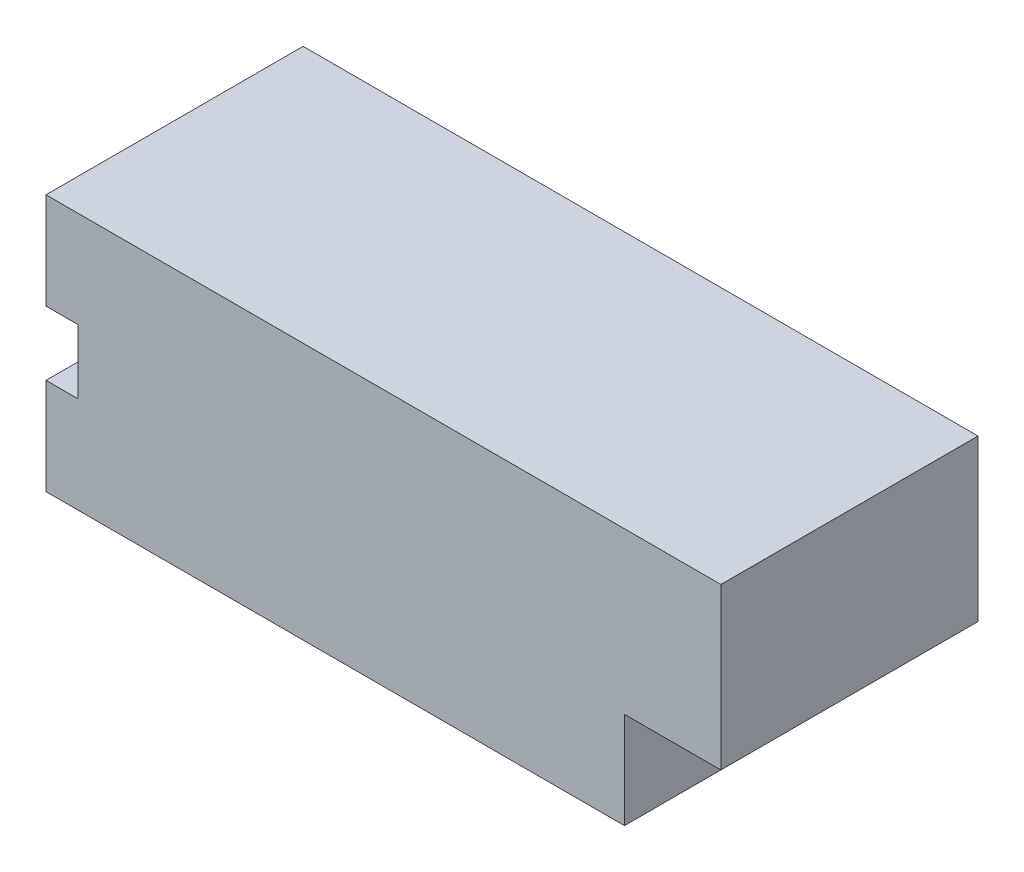
ISO-10303-21;
HEADER;
FILE_DESCRIPTION(('STEP AP214'),'2;1');
FILE_NAME('part.step','',(''),(''),'','','');
FILE_SCHEMA(('AUTOMOTIVE_DESIGN { 1 0 10303 214 1 1 1 1 }'));
ENDSEC;
DATA;
#1=APPLICATION_CONTEXT('core data for automotive mechanical design processes');
#2=APPLICATION_PROTOCOL_DEFINITION('international standard','automotive_design',2000,#1);
#3=PRODUCT_CONTEXT('',#1,'mechanical');
#4=PRODUCT('Part','Part','',(#3));
#5=PRODUCT_RELATED_PRODUCT_CATEGORY('part','',(#4));
#6=PRODUCT_DEFINITION_FORMATION('','',#4);
#7=PRODUCT_DEFINITION_CONTEXT('part definition',#1,'design');
#8=PRODUCT_DEFINITION('design','',#6,#7);
#9=PRODUCT_DEFINITION_SHAPE('','',#8);
#10=(LENGTH_UNIT() NAMED_UNIT(*) SI_UNIT(.MILLI.,.METRE.));
#11=(NAMED_UNIT(*) PLANE_ANGLE_UNIT() SI_UNIT($,.RADIAN.));
#12=(NAMED_UNIT(*) SI_UNIT($,.STERADIAN.) SOLID_ANGLE_UNIT());
#13=UNCERTAINTY_MEASURE_WITH_UNIT(LENGTH_MEASURE(1.E-05),#10,'distance_accuracy_value','');
#14=(GEOMETRIC_REPRESENTATION_CONTEXT(3) GLOBAL_UNCERTAINTY_ASSIGNED_CONTEXT((#13)) GLOBAL_UNIT_ASSIGNED_CONTEXT((#10,
#11,#12)) REPRESENTATION_CONTEXT('',''));
#15=CARTESIAN_POINT('',(0.,0.,0.));
#16=DIRECTION('',(0.,0.,1.));
#17=DIRECTION('',(1.,0.,0.));
#18=AXIS2_PLACEMENT_3D('',#15,#16,#17);
#19=CARTESIAN_POINT('',(80.,15.,20.));
#20=DIRECTION('',(0.,-1.,0.));
#21=DIRECTION('',(0.,0.,-1.));
#22=AXIS2_PLACEMENT_3D('',#19,#20,#21);
#23=PLANE('',#22);
#24=DIRECTION('',(-1.,0.,0.));
#25=VECTOR('',#24,1.);
#26=CARTESIAN_POINT('',(45.,15.,10.));
#27=LINE('',#26,#25);
#28=CARTESIAN_POINT('',(20.,15.,10.));
#29=VERTEX_POINT('',#28);
#30=CARTESIAN_POINT('',(15.,15.,10.));
#31=VERTEX_POINT('',#30);
#32=EDGE_CURVE('E209',#29,#31,#27,.T.);
#33=ORIENTED_EDGE('',*,*,#32,.T.);
#34=DIRECTION('',(0.,0.,-1.));
#35=VECTOR('',#34,1.);
#36=CARTESIAN_POINT('',(15.,15.,15.));
#37=LINE('',#36,#35);
#38=CARTESIAN_POINT('',(15.,15.,40.));
#39=VERTEX_POINT('',#38);
#40=EDGE_CURVE('E269',#39,#31,#37,.T.);
#41=ORIENTED_EDGE('',*,*,#40,.F.);
#42=DIRECTION('',(-1.,0.,0.));
#43=VECTOR('',#42,1.);
#44=CARTESIAN_POINT('',(70.,15.,40.));
#45=LINE('',#44,#43);
#46=CARTESIAN_POINT('',(20.,15.,40.));
#47=VERTEX_POINT('',#46);
#48=EDGE_CURVE('E11',#47,#39,#45,.T.);
#49=ORIENTED_EDGE('',*,*,#48,.F.);
#50=DIRECTION('',(0.,0.,-1.));
#51=VECTOR('',#50,1.);
#52=CARTESIAN_POINT('',(20.,15.,30.));
#53=LINE('',#52,#51);
#54=EDGE_CURVE('E236',#47,#29,#53,.T.);
#55=ORIENTED_EDGE('',*,*,#54,.T.);
#56=EDGE_LOOP('',(#33,#41,#49,#55));
#57=FACE_BOUND('',#56,.T.);
#58=ADVANCED_FACE('F40',(#57),#23,.F.);
#59=CARTESIAN_POINT('',(60.,20.,40.));
#60=DIRECTION('',(0.,0.,1.));
#61=DIRECTION('',(1.,0.,0.));
#62=AXIS2_PLACEMENT_3D('',#59,#60,#61);
#63=PLANE('',#62);
#64=ORIENTED_EDGE('',*,*,#48,.T.);
#65=DIRECTION('',(0.,1.,0.));
#66=VECTOR('',#65,1.);
#67=CARTESIAN_POINT('',(15.,20.,40.));
#68=LINE('',#67,#66);
#69=CARTESIAN_POINT('',(15.,0.,40.));
#70=VERTEX_POINT('',#69);
#71=EDGE_CURVE('E44',#70,#39,#68,.T.);
#72=ORIENTED_EDGE('',*,*,#71,.F.);
#73=DIRECTION('',(1.,0.,0.));
#74=VECTOR('',#73,1.);
#75=CARTESIAN_POINT('',(0.,0.,40.));
#76=LINE('',#75,#74);
#77=CARTESIAN_POINT('',(105.,0.,40.));
#78=VERTEX_POINT('',#77);
#79=EDGE_CURVE('E125',#70,#78,#76,.T.);
#80=ORIENTED_EDGE('',*,*,#79,.T.);
#81=DIRECTION('',(0.,1.,0.));
#82=VECTOR('',#81,1.);
#83=CARTESIAN_POINT('',(105.,10.,40.));
#84=LINE('',#83,#82);
#85=CARTESIAN_POINT('',(105.,15.,40.));
#86=VERTEX_POINT('',#85);
#87=EDGE_CURVE('E237',#78,#86,#84,.T.);
#88=ORIENTED_EDGE('',*,*,#87,.T.);
#89=DIRECTION('',(-1.,0.,0.));
#90=VECTOR('',#89,1.);
#91=CARTESIAN_POINT('',(70.,15.,40.));
#92=LINE('',#91,#90);
#93=CARTESIAN_POINT('',(120.,15.,40.));
#94=VERTEX_POINT('',#93);
#95=EDGE_CURVE('E196',#94,#86,#92,.T.);
#96=ORIENTED_EDGE('',*,*,#95,.F.);
#97=DIRECTION('',(0.,1.,0.));
#98=VECTOR('',#97,1.);
#99=CARTESIAN_POINT('',(120.,0.,40.));
#100=LINE('',#99,#98);
#101=CARTESIAN_POINT('',(120.,40.,40.));
#102=VERTEX_POINT('',#101);
#103=EDGE_CURVE('E242',#94,#102,#100,.T.);
#104=ORIENTED_EDGE('',*,*,#103,.T.);
#105=DIRECTION('',(1.,0.,0.));
#106=VECTOR('',#105,1.);
#107=CARTESIAN_POINT('',(105.,40.,40.));
#108=LINE('',#107,#106);
#109=CARTESIAN_POINT('',(15.,40.,40.));
#110=VERTEX_POINT('',#109);
#111=EDGE_CURVE('E195',#110,#102,#108,.T.);
#112=ORIENTED_EDGE('',*,*,#111,.F.);
#113=DIRECTION('',(0.,1.,0.));
#114=VECTOR('',#113,1.);
#115=CARTESIAN_POINT('',(15.,20.,40.));
#116=LINE('',#115,#114);
#117=CARTESIAN_POINT('',(15.,25.0000001490116,40.));
#118=VERTEX_POINT('',#117);
#119=EDGE_CURVE('E179',#118,#110,#116,.T.);
#120=ORIENTED_EDGE('',*,*,#119,.F.);
#121=DIRECTION('',(1.,0.,0.));
#122=VECTOR('',#121,1.);
#123=CARTESIAN_POINT('',(30.,25.0000001490116,40.));
#124=LINE('',#123,#122);
#125=CARTESIAN_POINT('',(20.,25.0000001490116,40.));
#126=VERTEX_POINT('',#125);
#127=EDGE_CURVE('E261',#118,#126,#124,.T.);
#128=ORIENTED_EDGE('',*,*,#127,.T.);
#129=DIRECTION('',(0.,-1.,0.));
#130=VECTOR('',#129,1.);
#131=CARTESIAN_POINT('',(20.,22.5000000745058,40.));
#132=LINE('',#131,#130);
#133=EDGE_CURVE('E250',#126,#47,#132,.T.);
#134=ORIENTED_EDGE('',*,*,#133,.T.);
#135=EDGE_LOOP('',(#64,#72,#80,#88,#96,#104,#112,#120,#128,#134));
#136=FACE_BOUND('',#135,.T.);
#137=ADVANCED_FACE('F271',(#136),#63,.T.);
#138=CARTESIAN_POINT('',(60.,20.,0.));
#139=DIRECTION('',(0.,0.,1.));
#140=DIRECTION('',(1.,0.,0.));
#141=AXIS2_PLACEMENT_3D('',#138,#139,#140);
#142=PLANE('',#141);
#143=DIRECTION('',(0.,1.,0.));
#144=VECTOR('',#143,1.);
#145=CARTESIAN_POINT('',(105.,13.75,0.));
#146=LINE('',#145,#144);
#147=CARTESIAN_POINT('',(105.,0.,0.));
#148=VERTEX_POINT('',#147);
#149=CARTESIAN_POINT('',(105.,15.,0.));
#150=VERTEX_POINT('',#149);
#151=EDGE_CURVE('E247',#148,#150,#146,.T.);
#152=ORIENTED_EDGE('',*,*,#151,.F.);
#153=DIRECTION('',(1.,0.,0.));
#154=VECTOR('',#153,1.);
#155=CARTESIAN_POINT('',(0.,0.,0.));
#156=LINE('',#155,#154);
#157=CARTESIAN_POINT('',(15.,0.,0.));
#158=VERTEX_POINT('',#157);
#159=EDGE_CURVE('E51',#158,#148,#156,.T.);
#160=ORIENTED_EDGE('',*,*,#159,.F.);
#161=DIRECTION('',(0.,-1.,0.));
#162=VECTOR('',#161,1.);
#163=CARTESIAN_POINT('',(15.,20.,0.));
#164=LINE('',#163,#162);
#165=CARTESIAN_POINT('',(15.,15.,0.));
#166=VERTEX_POINT('',#165);
#167=EDGE_CURVE('E475',#166,#158,#164,.T.);
#168=ORIENTED_EDGE('',*,*,#167,.F.);
#169=DIRECTION('',(-1.,0.,0.));
#170=VECTOR('',#169,1.);
#171=CARTESIAN_POINT('',(30.,15.,0.));
#172=LINE('',#171,#170);
#173=CARTESIAN_POINT('',(0.,15.,0.));
#174=VERTEX_POINT('',#173);
#175=EDGE_CURVE('E221',#166,#174,#172,.T.);
#176=ORIENTED_EDGE('',*,*,#175,.T.);
#177=DIRECTION('',(0.,-1.,0.));
#178=VECTOR('',#177,1.);
#179=CARTESIAN_POINT('',(0.,40.,0.));
#180=LINE('',#179,#178);
#181=CARTESIAN_POINT('',(0.,25.,0.));
#182=VERTEX_POINT('',#181);
#183=EDGE_CURVE('E470',#182,#174,#180,.T.);
#184=ORIENTED_EDGE('',*,*,#183,.F.);
#185=DIRECTION('',(1.,0.,0.));
#186=VECTOR('',#185,1.);
#187=CARTESIAN_POINT('',(30.,25.,0.));
#188=LINE('',#187,#186);
#189=CARTESIAN_POINT('',(15.,25.,0.));
#190=VERTEX_POINT('',#189);
#191=EDGE_CURVE('E173',#182,#190,#188,.T.);
#192=ORIENTED_EDGE('',*,*,#191,.T.);
#193=DIRECTION('',(0.,-1.,0.));
#194=VECTOR('',#193,1.);
#195=CARTESIAN_POINT('',(15.,20.,0.));
#196=LINE('',#195,#194);
#197=CARTESIAN_POINT('',(15.,40.,0.));
#198=VERTEX_POINT('',#197);
#199=EDGE_CURVE('E167',#198,#190,#196,.T.);
#200=ORIENTED_EDGE('',*,*,#199,.F.);
#201=DIRECTION('',(1.,0.,0.));
#202=VECTOR('',#201,1.);
#203=CARTESIAN_POINT('',(105.,40.,0.));
#204=LINE('',#203,#202);
#205=CARTESIAN_POINT('',(120.,40.,0.));
#206=VERTEX_POINT('',#205);
#207=EDGE_CURVE('E170',#198,#206,#204,.T.);
#208=ORIENTED_EDGE('',*,*,#207,.T.);
#209=DIRECTION('',(0.,-1.,0.));
#210=VECTOR('',#209,1.);
#211=CARTESIAN_POINT('',(120.,0.,0.));
#212=LINE('',#211,#210);
#213=CARTESIAN_POINT('',(120.,15.,0.));
#214=VERTEX_POINT('',#213);
#215=EDGE_CURVE('E189',#206,#214,#212,.T.);
#216=ORIENTED_EDGE('',*,*,#215,.T.);
#217=DIRECTION('',(1.,0.,0.));
#218=VECTOR('',#217,1.);
#219=CARTESIAN_POINT('',(70.,15.,0.));
#220=LINE('',#219,#218);
#221=EDGE_CURVE('E235',#150,#214,#220,.T.);
#222=ORIENTED_EDGE('',*,*,#221,.F.);
#223=EDGE_LOOP('',(#152,#160,#168,#176,#184,#192,#200,#208,#216,#222));
#224=FACE_BOUND('',#223,.T.);
#225=ADVANCED_FACE('F169',(#224),#142,.F.);
#226=CARTESIAN_POINT('',(0.,0.,0.));
#227=DIRECTION('',(0.,-1.,0.));
#228=DIRECTION('',(0.,0.,-1.));
#229=AXIS2_PLACEMENT_3D('',#226,#227,#228);
#230=PLANE('',#229);
#231=DIRECTION('',(0.,0.,-1.));
#232=VECTOR('',#231,1.);
#233=CARTESIAN_POINT('',(105.,0.,10.));
#234=LINE('',#233,#232);
#235=EDGE_CURVE('E241',#78,#148,#234,.T.);
#236=ORIENTED_EDGE('',*,*,#235,.F.);
#237=ORIENTED_EDGE('',*,*,#79,.F.);
#238=DIRECTION('',(0.,0.,1.));
#239=VECTOR('',#238,1.);
#240=CARTESIAN_POINT('',(15.,0.,10.));
#241=LINE('',#240,#239);
#242=EDGE_CURVE('E270',#158,#70,#241,.T.);
#243=ORIENTED_EDGE('',*,*,#242,.F.);
#244=ORIENTED_EDGE('',*,*,#159,.T.);
#245=EDGE_LOOP('',(#236,#237,#243,#244));
#246=FACE_BOUND('',#245,.T.);
#247=ADVANCED_FACE('F300',(#246),#230,.T.);
#248=CARTESIAN_POINT('',(15.,32.5,10.));
#249=DIRECTION('',(1.,0.,0.));
#250=DIRECTION('',(0.,1.,0.));
#251=AXIS2_PLACEMENT_3D('',#248,#249,#250);
#252=PLANE('',#251);
#253=DIRECTION('',(0.,0.,1.));
#254=VECTOR('',#253,1.);
#255=CARTESIAN_POINT('',(15.,25.,15.));
#256=LINE('',#255,#254);
#257=CARTESIAN_POINT('',(15.,25.0000001490116,10.));
#258=VERTEX_POINT('',#257);
#259=EDGE_CURVE('E243',#190,#258,#256,.T.);
#260=ORIENTED_EDGE('',*,*,#259,.T.);
#261=DIRECTION('',(0.,0.,1.));
#262=VECTOR('',#261,1.);
#263=CARTESIAN_POINT('',(15.,25.0000001490116,30.));
#264=LINE('',#263,#262);
#265=EDGE_CURVE('E220',#258,#118,#264,.T.);
#266=ORIENTED_EDGE('',*,*,#265,.T.);
#267=ORIENTED_EDGE('',*,*,#119,.T.);
#268=DIRECTION('',(0.,0.,-1.));
#269=VECTOR('',#268,1.);
#270=CARTESIAN_POINT('',(15.,40.,10.));
#271=LINE('',#270,#269);
#272=EDGE_CURVE('E185',#110,#198,#271,.T.);
#273=ORIENTED_EDGE('',*,*,#272,.T.);
#274=ORIENTED_EDGE('',*,*,#199,.T.);
#275=EDGE_LOOP('',(#260,#266,#267,#273,#274));
#276=FACE_BOUND('',#275,.T.);
#277=ADVANCED_FACE('F191',(#276),#252,.F.);
#278=CARTESIAN_POINT('',(105.,0.,0.));
#279=DIRECTION('',(1.,0.,0.));
#280=DIRECTION('',(0.,1.,0.));
#281=AXIS2_PLACEMENT_3D('',#278,#279,#280);
#282=PLANE('',#281);
#283=DIRECTION('',(0.,0.,1.));
#284=VECTOR('',#283,1.);
#285=CARTESIAN_POINT('',(105.,15.,20.));
#286=LINE('',#285,#284);
#287=EDGE_CURVE('E231',#150,#86,#286,.T.);
#288=ORIENTED_EDGE('',*,*,#287,.T.);
#289=ORIENTED_EDGE('',*,*,#87,.F.);
#290=ORIENTED_EDGE('',*,*,#235,.T.);
#291=ORIENTED_EDGE('',*,*,#151,.T.);
#292=EDGE_LOOP('',(#288,#289,#290,#291));
#293=FACE_BOUND('',#292,.T.);
#294=ADVANCED_FACE('F308',(#293),#282,.T.);
#295=CARTESIAN_POINT('',(120.,40.,40.));
#296=DIRECTION('',(1.,0.,0.));
#297=DIRECTION('',(0.,1.,0.));
#298=AXIS2_PLACEMENT_3D('',#295,#296,#297);
#299=PLANE('',#298);
#300=DIRECTION('',(0.,0.,-1.));
#301=VECTOR('',#300,1.);
#302=CARTESIAN_POINT('',(120.,15.,40.));
#303=LINE('',#302,#301);
#304=EDGE_CURVE('E205',#94,#214,#303,.T.);
#305=ORIENTED_EDGE('',*,*,#304,.T.);
#306=ORIENTED_EDGE('',*,*,#215,.F.);
#307=DIRECTION('',(0.,0.,-1.));
#308=VECTOR('',#307,1.);
#309=CARTESIAN_POINT('',(120.,40.,40.));
#310=LINE('',#309,#308);
#311=EDGE_CURVE('E187',#102,#206,#310,.T.);
#312=ORIENTED_EDGE('',*,*,#311,.F.);
#313=ORIENTED_EDGE('',*,*,#103,.F.);
#314=EDGE_LOOP('',(#305,#306,#312,#313));
#315=FACE_BOUND('',#314,.T.);
#316=ADVANCED_FACE('F292',(#315),#299,.T.);
#317=CARTESIAN_POINT('',(120.,40.,0.));
#318=DIRECTION('',(0.,1.,0.));
#319=DIRECTION('',(1.,0.,0.));
#320=AXIS2_PLACEMENT_3D('',#317,#318,#319);
#321=PLANE('',#320);
#322=ORIENTED_EDGE('',*,*,#272,.F.);
#323=ORIENTED_EDGE('',*,*,#111,.T.);
#324=ORIENTED_EDGE('',*,*,#311,.T.);
#325=ORIENTED_EDGE('',*,*,#207,.F.);
#326=EDGE_LOOP('',(#322,#323,#324,#325));
#327=FACE_BOUND('',#326,.T.);
#328=ADVANCED_FACE('F183',(#327),#321,.T.);
#329=CARTESIAN_POINT('',(120.,15.,40.));
#330=DIRECTION('',(0.,-1.,0.));
#331=DIRECTION('',(0.,0.,-1.));
#332=AXIS2_PLACEMENT_3D('',#329,#330,#331);
#333=PLANE('',#332);
#334=ORIENTED_EDGE('',*,*,#287,.F.);
#335=ORIENTED_EDGE('',*,*,#221,.T.);
#336=ORIENTED_EDGE('',*,*,#304,.F.);
#337=ORIENTED_EDGE('',*,*,#95,.T.);
#338=EDGE_LOOP('',(#334,#335,#336,#337));
#339=FACE_BOUND('',#338,.T.);
#340=ADVANCED_FACE('F280',(#339),#333,.T.);
#341=CARTESIAN_POINT('',(20.,25.0000001490116,40.));
#342=DIRECTION('',(1.,0.,0.));
#343=DIRECTION('',(0.,1.,0.));
#344=AXIS2_PLACEMENT_3D('',#341,#342,#343);
#345=PLANE('',#344);
#346=ORIENTED_EDGE('',*,*,#133,.F.);
#347=DIRECTION('',(0.,0.,-1.));
#348=VECTOR('',#347,1.);
#349=CARTESIAN_POINT('',(20.,25.0000001490116,40.));
#350=LINE('',#349,#348);
#351=CARTESIAN_POINT('',(20.,25.0000001490116,10.));
#352=VERTEX_POINT('',#351);
#353=EDGE_CURVE('E219',#126,#352,#350,.T.);
#354=ORIENTED_EDGE('',*,*,#353,.T.);
#355=DIRECTION('',(0.,-1.,0.));
#356=VECTOR('',#355,1.);
#357=CARTESIAN_POINT('',(20.,25.0000001490116,10.));
#358=LINE('',#357,#356);
#359=EDGE_CURVE('E253',#352,#29,#358,.T.);
#360=ORIENTED_EDGE('',*,*,#359,.T.);
#361=ORIENTED_EDGE('',*,*,#54,.F.);
#362=EDGE_LOOP('',(#346,#354,#360,#361));
#363=FACE_BOUND('',#362,.T.);
#364=ADVANCED_FACE('F42',(#363),#345,.F.);
#365=CARTESIAN_POINT('',(10.,20.0000000745058,10.));
#366=DIRECTION('',(0.,0.,-1.));
#367=DIRECTION('',(0.,-1.,0.));
#368=AXIS2_PLACEMENT_3D('',#365,#366,#367);
#369=PLANE('',#368);
#370=ORIENTED_EDGE('',*,*,#32,.F.);
#371=ORIENTED_EDGE('',*,*,#359,.F.);
#372=DIRECTION('',(1.,0.,0.));
#373=VECTOR('',#372,1.);
#374=CARTESIAN_POINT('',(0.,25.0000001490116,10.));
#375=LINE('',#374,#373);
#376=EDGE_CURVE('E215',#258,#352,#375,.T.);
#377=ORIENTED_EDGE('',*,*,#376,.F.);
#378=DIRECTION('',(1.,0.,0.));
#379=VECTOR('',#378,1.);
#380=CARTESIAN_POINT('',(5.,25.,10.));
#381=LINE('',#380,#379);
#382=CARTESIAN_POINT('',(0.,25.0000001490116,10.));
#383=VERTEX_POINT('',#382);
#384=EDGE_CURVE('E246',#383,#258,#381,.T.);
#385=ORIENTED_EDGE('',*,*,#384,.F.);
#386=DIRECTION('',(0.,1.,0.));
#387=VECTOR('',#386,1.);
#388=CARTESIAN_POINT('',(0.,30.0000000372529,10.));
#389=LINE('',#388,#387);
#390=CARTESIAN_POINT('',(0.,15.,10.));
#391=VERTEX_POINT('',#390);
#392=EDGE_CURVE('E214',#391,#383,#389,.T.);
#393=ORIENTED_EDGE('',*,*,#392,.F.);
#394=DIRECTION('',(-1.,0.,0.));
#395=VECTOR('',#394,1.);
#396=CARTESIAN_POINT('',(5.,15.,10.));
#397=LINE('',#396,#395);
#398=EDGE_CURVE('E227',#31,#391,#397,.T.);
#399=ORIENTED_EDGE('',*,*,#398,.F.);
#400=EDGE_LOOP('',(#370,#371,#377,#385,#393,#399));
#401=FACE_BOUND('',#400,.T.);
#402=ADVANCED_FACE('F337',(#401),#369,.F.);
#403=CARTESIAN_POINT('',(0.,25.0000001490116,40.));
#404=DIRECTION('',(0.,1.,0.));
#405=DIRECTION('',(1.,0.,0.));
#406=AXIS2_PLACEMENT_3D('',#403,#404,#405);
#407=PLANE('',#406);
#408=ORIENTED_EDGE('',*,*,#265,.F.);
#409=ORIENTED_EDGE('',*,*,#376,.T.);
#410=ORIENTED_EDGE('',*,*,#353,.F.);
#411=ORIENTED_EDGE('',*,*,#127,.F.);
#412=EDGE_LOOP('',(#408,#409,#410,#411));
#413=FACE_BOUND('',#412,.T.);
#414=ADVANCED_FACE('F318',(#413),#407,.F.);
#415=CARTESIAN_POINT('',(15.,32.5,10.));
#416=DIRECTION('',(1.,0.,0.));
#417=DIRECTION('',(0.,1.,0.));
#418=AXIS2_PLACEMENT_3D('',#415,#416,#417);
#419=PLANE('',#418);
#420=DIRECTION('',(0.,0.,-1.));
#421=VECTOR('',#420,1.);
#422=CARTESIAN_POINT('',(15.,15.,5.));
#423=LINE('',#422,#421);
#424=EDGE_CURVE('E225',#31,#166,#423,.T.);
#425=ORIENTED_EDGE('',*,*,#424,.T.);
#426=ORIENTED_EDGE('',*,*,#167,.T.);
#427=ORIENTED_EDGE('',*,*,#242,.T.);
#428=ORIENTED_EDGE('',*,*,#71,.T.);
#429=ORIENTED_EDGE('',*,*,#40,.T.);
#430=EDGE_LOOP('',(#425,#426,#427,#428,#429));
#431=FACE_BOUND('',#430,.T.);
#432=ADVANCED_FACE('F313',(#431),#419,.F.);
#433=CARTESIAN_POINT('',(0.,40.,0.));
#434=DIRECTION('',(-1.,0.,0.));
#435=DIRECTION('',(0.,0.,1.));
#436=AXIS2_PLACEMENT_3D('',#433,#434,#435);
#437=PLANE('',#436);
#438=ORIENTED_EDGE('',*,*,#392,.T.);
#439=DIRECTION('',(0.,0.,-1.));
#440=VECTOR('',#439,1.);
#441=CARTESIAN_POINT('',(0.,25.,10.));
#442=LINE('',#441,#440);
#443=EDGE_CURVE('E211',#383,#182,#442,.T.);
#444=ORIENTED_EDGE('',*,*,#443,.T.);
#445=ORIENTED_EDGE('',*,*,#183,.T.);
#446=DIRECTION('',(0.,0.,1.));
#447=VECTOR('',#446,1.);
#448=CARTESIAN_POINT('',(0.,15.,0.));
#449=LINE('',#448,#447);
#450=EDGE_CURVE('E226',#174,#391,#449,.T.);
#451=ORIENTED_EDGE('',*,*,#450,.T.);
#452=EDGE_LOOP('',(#438,#444,#445,#451));
#453=FACE_BOUND('',#452,.T.);
#454=ADVANCED_FACE('F317',(#453),#437,.T.);
#455=CARTESIAN_POINT('',(0.,25.,20.));
#456=DIRECTION('',(0.,-1.,0.));
#457=DIRECTION('',(0.,0.,-1.));
#458=AXIS2_PLACEMENT_3D('',#455,#456,#457);
#459=PLANE('',#458);
#460=ORIENTED_EDGE('',*,*,#384,.T.);
#461=ORIENTED_EDGE('',*,*,#259,.F.);
#462=ORIENTED_EDGE('',*,*,#191,.F.);
#463=ORIENTED_EDGE('',*,*,#443,.F.);
#464=EDGE_LOOP('',(#460,#461,#462,#463));
#465=FACE_BOUND('',#464,.T.);
#466=ADVANCED_FACE('F328',(#465),#459,.F.);
#467=CARTESIAN_POINT('',(0.,15.,0.));
#468=DIRECTION('',(0.,1.,0.));
#469=DIRECTION('',(1.,0.,0.));
#470=AXIS2_PLACEMENT_3D('',#467,#468,#469);
#471=PLANE('',#470);
#472=ORIENTED_EDGE('',*,*,#398,.T.);
#473=ORIENTED_EDGE('',*,*,#450,.F.);
#474=ORIENTED_EDGE('',*,*,#175,.F.);
#475=ORIENTED_EDGE('',*,*,#424,.F.);
#476=EDGE_LOOP('',(#472,#473,#474,#475));
#477=FACE_BOUND('',#476,.T.);
#478=ADVANCED_FACE('F324',(#477),#471,.F.);
#479=CLOSED_SHELL('',(#58,#137,#225,#247,#277,#294,#316,#328,#340,#364,#402,#414,#432,#454,#466,#478));
#480=MANIFOLD_SOLID_BREP('B2',#479);
#481=ADVANCED_BREP_SHAPE_REPRESENTATION('',(#18,#480),#14);
#482=SHAPE_DEFINITION_REPRESENTATION(#9,#481);
ENDSEC;
END-ISO-10303-21;
